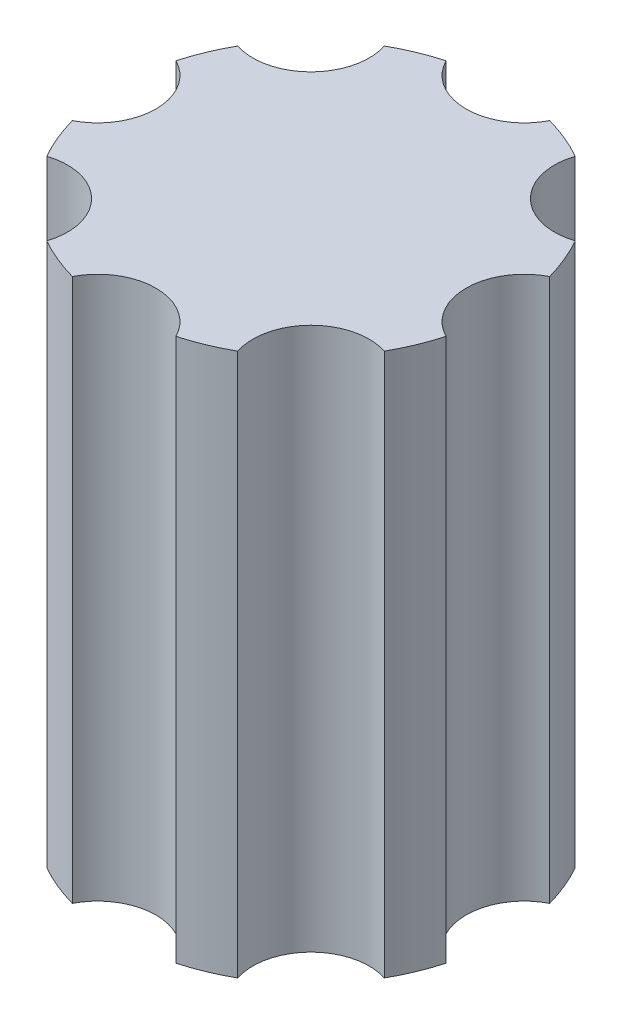
ISO-10303-21;
HEADER;
FILE_DESCRIPTION(('STEP AP214'),'2;1');
FILE_NAME('part.step','',(''),(''),'','','');
FILE_SCHEMA(('AUTOMOTIVE_DESIGN { 1 0 10303 214 1 1 1 1 }'));
ENDSEC;
DATA;
#1=APPLICATION_CONTEXT('core data for automotive mechanical design processes');
#2=APPLICATION_PROTOCOL_DEFINITION('international standard','automotive_design',2000,#1);
#3=PRODUCT_CONTEXT('',#1,'mechanical');
#4=PRODUCT('Part','Part','',(#3));
#5=PRODUCT_RELATED_PRODUCT_CATEGORY('part','',(#4));
#6=PRODUCT_DEFINITION_FORMATION('','',#4);
#7=PRODUCT_DEFINITION_CONTEXT('part definition',#1,'design');
#8=PRODUCT_DEFINITION('design','',#6,#7);
#9=PRODUCT_DEFINITION_SHAPE('','',#8);
#10=(LENGTH_UNIT() NAMED_UNIT(*) SI_UNIT(.MILLI.,.METRE.));
#11=(NAMED_UNIT(*) PLANE_ANGLE_UNIT() SI_UNIT($,.RADIAN.));
#12=(NAMED_UNIT(*) SI_UNIT($,.STERADIAN.) SOLID_ANGLE_UNIT());
#13=UNCERTAINTY_MEASURE_WITH_UNIT(LENGTH_MEASURE(1.E-05),#10,'distance_accuracy_value','');
#14=(GEOMETRIC_REPRESENTATION_CONTEXT(3) GLOBAL_UNCERTAINTY_ASSIGNED_CONTEXT((#13)) GLOBAL_UNIT_ASSIGNED_CONTEXT((#10,
#11,#12)) REPRESENTATION_CONTEXT('',''));
#15=CARTESIAN_POINT('',(0.,0.,0.));
#16=DIRECTION('',(0.,0.,1.));
#17=DIRECTION('',(1.,0.,0.));
#18=AXIS2_PLACEMENT_3D('',#15,#16,#17);
#19=CARTESIAN_POINT('',(0.,12.,0.));
#20=DIRECTION('',(0.,-1.,0.));
#21=DIRECTION('',(0.,0.,-1.));
#22=AXIS2_PLACEMENT_3D('',#19,#20,#21);
#23=CYLINDRICAL_SURFACE('',#22,5.);
#24=CARTESIAN_POINT('',(0.,0.,0.));
#25=DIRECTION('',(0.,1.,0.));
#26=DIRECTION('',(0.,0.,1.));
#27=AXIS2_PLACEMENT_3D('',#24,#25,#26);
#28=CIRCLE('',#27,5.);
#29=CARTESIAN_POINT('',(-4.35172402257276,0.,-2.46221405067942));
#30=VERTEX_POINT('',#29);
#31=CARTESIAN_POINT('',(-4.81818181818182,0.,-1.33608531424535));
#32=VERTEX_POINT('',#31);
#33=EDGE_CURVE('E192',#30,#32,#28,.T.);
#34=ORIENTED_EDGE('',*,*,#33,.T.);
#35=DIRECTION('',(0.,1.,0.));
#36=VECTOR('',#35,1.);
#37=CARTESIAN_POINT('',(-4.81818181818182,7.,-1.33608531424535));
#38=LINE('',#37,#36);
#39=CARTESIAN_POINT('',(-4.81818181818182,14.,-1.33608531424535));
#40=VERTEX_POINT('',#39);
#41=EDGE_CURVE('E247',#32,#40,#38,.T.);
#42=ORIENTED_EDGE('',*,*,#41,.T.);
#43=CARTESIAN_POINT('',(0.,14.,0.));
#44=DIRECTION('',(0.,1.,0.));
#45=DIRECTION('',(0.,0.,1.));
#46=AXIS2_PLACEMENT_3D('',#43,#44,#45);
#47=CIRCLE('',#46,5.);
#48=CARTESIAN_POINT('',(-4.35172402257276,14.,-2.46221405067943));
#49=VERTEX_POINT('',#48);
#50=EDGE_CURVE('E237',#49,#40,#47,.T.);
#51=ORIENTED_EDGE('',*,*,#50,.F.);
#52=DIRECTION('',(0.,1.,0.));
#53=VECTOR('',#52,1.);
#54=CARTESIAN_POINT('',(-4.35172402257276,7.,-2.46221405067942));
#55=LINE('',#54,#53);
#56=EDGE_CURVE('E181',#49,#30,#55,.F.);
#57=ORIENTED_EDGE('',*,*,#56,.T.);
#58=EDGE_LOOP('',(#34,#42,#51,#57));
#59=FACE_BOUND('',#58,.T.);
#60=ADVANCED_FACE('F45',(#59),#23,.T.);
#61=CARTESIAN_POINT('',(-4.81818181818181,14.,1.33608531424539));
#62=VERTEX_POINT('',#61);
#63=CARTESIAN_POINT('',(-4.35172402257274,14.,2.46221405067945));
#64=VERTEX_POINT('',#63);
#65=EDGE_CURVE('E348',#62,#64,#47,.T.);
#66=ORIENTED_EDGE('',*,*,#65,.F.);
#67=DIRECTION('',(0.,1.,0.));
#68=VECTOR('',#67,1.);
#69=CARTESIAN_POINT('',(-4.81818181818181,7.,1.33608531424539));
#70=LINE('',#69,#68);
#71=CARTESIAN_POINT('',(-4.81818181818181,0.,1.33608531424539));
#72=VERTEX_POINT('',#71);
#73=EDGE_CURVE('E251',#62,#72,#70,.F.);
#74=ORIENTED_EDGE('',*,*,#73,.T.);
#75=CARTESIAN_POINT('',(-4.35172402257274,0.,2.46221405067945));
#76=VERTEX_POINT('',#75);
#77=EDGE_CURVE('E208',#72,#76,#28,.T.);
#78=ORIENTED_EDGE('',*,*,#77,.T.);
#79=DIRECTION('',(0.,1.,0.));
#80=VECTOR('',#79,1.);
#81=CARTESIAN_POINT('',(-4.35172402257274,7.,2.46221405067945));
#82=LINE('',#81,#80);
#83=EDGE_CURVE('E255',#76,#64,#82,.T.);
#84=ORIENTED_EDGE('',*,*,#83,.T.);
#85=EDGE_LOOP('',(#66,#74,#78,#84));
#86=FACE_BOUND('',#85,.T.);
#87=ADVANCED_FACE('F336',(#86),#23,.T.);
#88=CARTESIAN_POINT('',(-2.46221405067941,14.,4.35172402257276));
#89=VERTEX_POINT('',#88);
#90=CARTESIAN_POINT('',(-1.33608531424537,14.,4.81818181818182));
#91=VERTEX_POINT('',#90);
#92=EDGE_CURVE('E344',#89,#91,#47,.T.);
#93=ORIENTED_EDGE('',*,*,#92,.F.);
#94=DIRECTION('',(0.,1.,0.));
#95=VECTOR('',#94,1.);
#96=CARTESIAN_POINT('',(-2.46221405067941,7.,4.35172402257276));
#97=LINE('',#96,#95);
#98=CARTESIAN_POINT('',(-2.46221405067941,0.,4.35172402257276));
#99=VERTEX_POINT('',#98);
#100=EDGE_CURVE('E259',#89,#99,#97,.F.);
#101=ORIENTED_EDGE('',*,*,#100,.T.);
#102=CARTESIAN_POINT('',(-1.33608531424537,0.,4.81818181818182));
#103=VERTEX_POINT('',#102);
#104=EDGE_CURVE('E325',#99,#103,#28,.T.);
#105=ORIENTED_EDGE('',*,*,#104,.T.);
#106=DIRECTION('',(0.,1.,0.));
#107=VECTOR('',#106,1.);
#108=CARTESIAN_POINT('',(-1.33608531424537,7.,4.81818181818182));
#109=LINE('',#108,#107);
#110=EDGE_CURVE('E263',#103,#91,#109,.T.);
#111=ORIENTED_EDGE('',*,*,#110,.T.);
#112=EDGE_LOOP('',(#93,#101,#105,#111));
#113=FACE_BOUND('',#112,.T.);
#114=ADVANCED_FACE('F342',(#113),#23,.T.);
#115=CARTESIAN_POINT('',(1.33608531424537,14.,4.81818181818182));
#116=VERTEX_POINT('',#115);
#117=CARTESIAN_POINT('',(2.46221405067947,14.,4.35172402257273));
#118=VERTEX_POINT('',#117);
#119=EDGE_CURVE('E349',#116,#118,#47,.T.);
#120=ORIENTED_EDGE('',*,*,#119,.F.);
#121=DIRECTION('',(0.,1.,0.));
#122=VECTOR('',#121,1.);
#123=CARTESIAN_POINT('',(1.33608531424537,7.,4.81818181818182));
#124=LINE('',#123,#122);
#125=CARTESIAN_POINT('',(1.33608531424537,0.,4.81818181818182));
#126=VERTEX_POINT('',#125);
#127=EDGE_CURVE('E267',#116,#126,#124,.F.);
#128=ORIENTED_EDGE('',*,*,#127,.T.);
#129=CARTESIAN_POINT('',(2.46221405067947,0.,4.35172402257273));
#130=VERTEX_POINT('',#129);
#131=EDGE_CURVE('E322',#126,#130,#28,.T.);
#132=ORIENTED_EDGE('',*,*,#131,.T.);
#133=DIRECTION('',(0.,1.,0.));
#134=VECTOR('',#133,1.);
#135=CARTESIAN_POINT('',(2.46221405067947,7.,4.35172402257273));
#136=LINE('',#135,#134);
#137=EDGE_CURVE('E271',#130,#118,#136,.T.);
#138=ORIENTED_EDGE('',*,*,#137,.T.);
#139=EDGE_LOOP('',(#120,#128,#132,#138));
#140=FACE_BOUND('',#139,.T.);
#141=ADVANCED_FACE('F398',(#140),#23,.T.);
#142=CARTESIAN_POINT('',(4.35172402257277,14.,2.4622140506794));
#143=VERTEX_POINT('',#142);
#144=CARTESIAN_POINT('',(4.81818181818183,14.,1.33608531424532));
#145=VERTEX_POINT('',#144);
#146=EDGE_CURVE('E353',#143,#145,#47,.T.);
#147=ORIENTED_EDGE('',*,*,#146,.F.);
#148=DIRECTION('',(0.,1.,0.));
#149=VECTOR('',#148,1.);
#150=CARTESIAN_POINT('',(4.35172402257277,7.,2.46221405067939));
#151=LINE('',#150,#149);
#152=CARTESIAN_POINT('',(4.35172402257277,0.,2.46221405067939));
#153=VERTEX_POINT('',#152);
#154=EDGE_CURVE('E275',#143,#153,#151,.F.);
#155=ORIENTED_EDGE('',*,*,#154,.T.);
#156=CARTESIAN_POINT('',(4.81818181818183,0.,1.33608531424532));
#157=VERTEX_POINT('',#156);
#158=EDGE_CURVE('E221',#153,#157,#28,.T.);
#159=ORIENTED_EDGE('',*,*,#158,.T.);
#160=DIRECTION('',(0.,1.,0.));
#161=VECTOR('',#160,1.);
#162=CARTESIAN_POINT('',(4.81818181818183,7.,1.33608531424532));
#163=LINE('',#162,#161);
#164=EDGE_CURVE('E279',#157,#145,#163,.T.);
#165=ORIENTED_EDGE('',*,*,#164,.T.);
#166=EDGE_LOOP('',(#147,#155,#159,#165));
#167=FACE_BOUND('',#166,.T.);
#168=ADVANCED_FACE('F319',(#167),#23,.T.);
#169=CARTESIAN_POINT('',(4.81818181818181,14.,-1.33608531424542));
#170=VERTEX_POINT('',#169);
#171=CARTESIAN_POINT('',(4.35172402257272,14.,-2.46221405067948));
#172=VERTEX_POINT('',#171);
#173=EDGE_CURVE('E357',#170,#172,#47,.T.);
#174=ORIENTED_EDGE('',*,*,#173,.F.);
#175=DIRECTION('',(0.,1.,0.));
#176=VECTOR('',#175,1.);
#177=CARTESIAN_POINT('',(4.8181818181818,7.,-1.33608531424542));
#178=LINE('',#177,#176);
#179=CARTESIAN_POINT('',(4.8181818181818,0.,-1.33608531424542));
#180=VERTEX_POINT('',#179);
#181=EDGE_CURVE('E69',#170,#180,#178,.F.);
#182=ORIENTED_EDGE('',*,*,#181,.T.);
#183=CARTESIAN_POINT('',(4.35172402257272,0.,-2.46221405067948));
#184=VERTEX_POINT('',#183);
#185=EDGE_CURVE('E212',#180,#184,#28,.T.);
#186=ORIENTED_EDGE('',*,*,#185,.T.);
#187=DIRECTION('',(0.,1.,0.));
#188=VECTOR('',#187,1.);
#189=CARTESIAN_POINT('',(4.35172402257272,7.,-2.46221405067948));
#190=LINE('',#189,#188);
#191=EDGE_CURVE('E285',#184,#172,#190,.T.);
#192=ORIENTED_EDGE('',*,*,#191,.T.);
#193=EDGE_LOOP('',(#174,#182,#186,#192));
#194=FACE_BOUND('',#193,.T.);
#195=ADVANCED_FACE('F388',(#194),#23,.T.);
#196=CARTESIAN_POINT('',(-1.33608531424537,0.,-4.81818181818182));
#197=VERTEX_POINT('',#196);
#198=CARTESIAN_POINT('',(-2.46221405067944,0.,-4.35172402257275));
#199=VERTEX_POINT('',#198);
#200=EDGE_CURVE('E189',#197,#199,#28,.T.);
#201=ORIENTED_EDGE('',*,*,#200,.T.);
#202=DIRECTION('',(0.,1.,0.));
#203=VECTOR('',#202,1.);
#204=CARTESIAN_POINT('',(-2.46221405067944,7.,-4.35172402257275));
#205=LINE('',#204,#203);
#206=CARTESIAN_POINT('',(-2.46221405067944,14.,-4.35172402257275));
#207=VERTEX_POINT('',#206);
#208=EDGE_CURVE('E169',#199,#207,#205,.T.);
#209=ORIENTED_EDGE('',*,*,#208,.T.);
#210=CARTESIAN_POINT('',(-1.33608531424537,14.,-4.81818181818182));
#211=VERTEX_POINT('',#210);
#212=EDGE_CURVE('E228',#211,#207,#47,.T.);
#213=ORIENTED_EDGE('',*,*,#212,.F.);
#214=DIRECTION('',(0.,1.,0.));
#215=VECTOR('',#214,1.);
#216=CARTESIAN_POINT('',(-1.33608531424537,7.,-4.81818181818182));
#217=LINE('',#216,#215);
#218=EDGE_CURVE('E198',#211,#197,#217,.F.);
#219=ORIENTED_EDGE('',*,*,#218,.T.);
#220=EDGE_LOOP('',(#201,#209,#213,#219));
#221=FACE_BOUND('',#220,.T.);
#222=ADVANCED_FACE('F197',(#221),#23,.T.);
#223=CARTESIAN_POINT('',(0.,12.,0.));
#224=DIRECTION('',(0.,-1.,0.));
#225=DIRECTION('',(0.,0.,-1.));
#226=AXIS2_PLACEMENT_3D('',#223,#224,#225);
#227=CYLINDRICAL_SURFACE('',#226,3.);
#228=CARTESIAN_POINT('',(0.,0.,0.));
#229=DIRECTION('',(0.,1.,0.));
#230=DIRECTION('',(0.,0.,1.));
#231=AXIS2_PLACEMENT_3D('',#228,#229,#230);
#232=CIRCLE('',#231,3.);
#233=CARTESIAN_POINT('',(2.23606797749979,0.,2.));
#234=VERTEX_POINT('',#233);
#235=CARTESIAN_POINT('',(-2.23606797749979,0.,2.));
#236=VERTEX_POINT('',#235);
#237=EDGE_CURVE('E223',#234,#236,#232,.T.);
#238=ORIENTED_EDGE('',*,*,#237,.F.);
#239=DIRECTION('',(0.,-1.,0.));
#240=VECTOR('',#239,1.);
#241=CARTESIAN_POINT('',(2.23606797749979,12.,2.));
#242=LINE('',#241,#240);
#243=CARTESIAN_POINT('',(2.23606797749979,12.,2.));
#244=VERTEX_POINT('',#243);
#245=EDGE_CURVE('E372',#244,#234,#242,.T.);
#246=ORIENTED_EDGE('',*,*,#245,.F.);
#247=CARTESIAN_POINT('',(0.,12.,0.));
#248=DIRECTION('',(0.,1.,0.));
#249=DIRECTION('',(0.,0.,1.));
#250=AXIS2_PLACEMENT_3D('',#247,#248,#249);
#251=CIRCLE('',#250,3.);
#252=CARTESIAN_POINT('',(-2.23606797749979,12.,2.));
#253=VERTEX_POINT('',#252);
#254=EDGE_CURVE('E200',#244,#253,#251,.T.);
#255=ORIENTED_EDGE('',*,*,#254,.T.);
#256=DIRECTION('',(0.,-1.,0.));
#257=VECTOR('',#256,1.);
#258=CARTESIAN_POINT('',(-2.23606797749979,12.,2.));
#259=LINE('',#258,#257);
#260=EDGE_CURVE('E233',#253,#236,#259,.T.);
#261=ORIENTED_EDGE('',*,*,#260,.T.);
#262=EDGE_LOOP('',(#238,#246,#255,#261));
#263=FACE_BOUND('',#262,.T.);
#264=ADVANCED_FACE('F47',(#263),#227,.F.);
#265=CARTESIAN_POINT('',(0.,12.,2.));
#266=DIRECTION('',(0.,0.,-1.));
#267=DIRECTION('',(-1.,0.,0.));
#268=AXIS2_PLACEMENT_3D('',#265,#266,#267);
#269=PLANE('',#268);
#270=DIRECTION('',(1.,0.,0.));
#271=VECTOR('',#270,1.);
#272=CARTESIAN_POINT('',(0.,0.,2.));
#273=LINE('',#272,#271);
#274=EDGE_CURVE('E213',#236,#234,#273,.T.);
#275=ORIENTED_EDGE('',*,*,#274,.F.);
#276=ORIENTED_EDGE('',*,*,#260,.F.);
#277=DIRECTION('',(1.,0.,0.));
#278=VECTOR('',#277,1.);
#279=CARTESIAN_POINT('',(0.,12.,2.));
#280=LINE('',#279,#278);
#281=EDGE_CURVE('E206',#253,#244,#280,.T.);
#282=ORIENTED_EDGE('',*,*,#281,.T.);
#283=ORIENTED_EDGE('',*,*,#245,.T.);
#284=EDGE_LOOP('',(#275,#276,#282,#283));
#285=FACE_BOUND('',#284,.T.);
#286=ADVANCED_FACE('F376',(#285),#269,.T.);
#287=CARTESIAN_POINT('',(2.46221405067938,14.,-4.35172402257278));
#288=VERTEX_POINT('',#287);
#289=CARTESIAN_POINT('',(1.33608531424537,14.,-4.81818181818182));
#290=VERTEX_POINT('',#289);
#291=EDGE_CURVE('E238',#288,#290,#47,.T.);
#292=ORIENTED_EDGE('',*,*,#291,.F.);
#293=DIRECTION('',(0.,1.,0.));
#294=VECTOR('',#293,1.);
#295=CARTESIAN_POINT('',(2.46221405067938,7.,-4.35172402257278));
#296=LINE('',#295,#294);
#297=CARTESIAN_POINT('',(2.46221405067938,0.,-4.35172402257278));
#298=VERTEX_POINT('',#297);
#299=EDGE_CURVE('E61',#288,#298,#296,.F.);
#300=ORIENTED_EDGE('',*,*,#299,.T.);
#301=CARTESIAN_POINT('',(1.33608531424537,0.,-4.81818181818182));
#302=VERTEX_POINT('',#301);
#303=EDGE_CURVE('E202',#298,#302,#28,.T.);
#304=ORIENTED_EDGE('',*,*,#303,.T.);
#305=DIRECTION('',(0.,1.,0.));
#306=VECTOR('',#305,1.);
#307=CARTESIAN_POINT('',(1.33608531424537,7.,-4.81818181818182));
#308=LINE('',#307,#306);
#309=EDGE_CURVE('E239',#302,#290,#308,.T.);
#310=ORIENTED_EDGE('',*,*,#309,.T.);
#311=EDGE_LOOP('',(#292,#300,#304,#310));
#312=FACE_BOUND('',#311,.T.);
#313=ADVANCED_FACE('F374',(#312),#23,.T.);
#314=CARTESIAN_POINT('',(0.,0.,0.));
#315=DIRECTION('',(0.,1.,0.));
#316=DIRECTION('',(0.,0.,1.));
#317=AXIS2_PLACEMENT_3D('',#314,#315,#316);
#318=PLANE('',#317);
#319=ORIENTED_EDGE('',*,*,#237,.T.);
#320=ORIENTED_EDGE('',*,*,#274,.T.);
#321=EDGE_LOOP('',(#319,#320));
#322=FACE_BOUND('',#321,.T.);
#323=ORIENTED_EDGE('',*,*,#77,.F.);
#324=CARTESIAN_POINT('',(-5.5,0.,0.));
#325=DIRECTION('',(0.,1.,0.));
#326=DIRECTION('',(1.,0.,0.));
#327=AXIS2_PLACEMENT_3D('',#324,#325,#326);
#328=CIRCLE('',#327,1.5);
#329=EDGE_CURVE('E194',#72,#32,#328,.T.);
#330=ORIENTED_EDGE('',*,*,#329,.T.);
#331=ORIENTED_EDGE('',*,*,#33,.F.);
#332=CARTESIAN_POINT('',(-3.88908729652602,0.,-3.889087296526));
#333=DIRECTION('',(0.,1.,0.));
#334=DIRECTION('',(0.707106781186549,0.,0.707106781186546));
#335=AXIS2_PLACEMENT_3D('',#332,#333,#334);
#336=CIRCLE('',#335,1.5);
#337=EDGE_CURVE('E172',#30,#199,#336,.T.);
#338=ORIENTED_EDGE('',*,*,#337,.T.);
#339=ORIENTED_EDGE('',*,*,#200,.F.);
#340=CARTESIAN_POINT('',(0.,0.,-5.5));
#341=DIRECTION('',(0.,1.,0.));
#342=DIRECTION('',(0.,0.,1.));
#343=AXIS2_PLACEMENT_3D('',#340,#341,#342);
#344=CIRCLE('',#343,1.5);
#345=EDGE_CURVE('E244',#197,#302,#344,.T.);
#346=ORIENTED_EDGE('',*,*,#345,.T.);
#347=ORIENTED_EDGE('',*,*,#303,.F.);
#348=CARTESIAN_POINT('',(3.88908729652596,0.,-3.88908729652606));
#349=DIRECTION('',(0.,1.,0.));
#350=DIRECTION('',(-0.707106781186539,0.,0.707106781186556));
#351=AXIS2_PLACEMENT_3D('',#348,#349,#350);
#352=CIRCLE('',#351,1.5);
#353=EDGE_CURVE('E308',#298,#184,#352,.T.);
#354=ORIENTED_EDGE('',*,*,#353,.T.);
#355=ORIENTED_EDGE('',*,*,#185,.F.);
#356=CARTESIAN_POINT('',(5.5,0.,0.));
#357=DIRECTION('',(0.,1.,0.));
#358=DIRECTION('',(-1.,0.,0.));
#359=AXIS2_PLACEMENT_3D('',#356,#357,#358);
#360=CIRCLE('',#359,1.5);
#361=EDGE_CURVE('E298',#180,#157,#360,.T.);
#362=ORIENTED_EDGE('',*,*,#361,.T.);
#363=ORIENTED_EDGE('',*,*,#158,.F.);
#364=CARTESIAN_POINT('',(3.88908729652605,0.,3.88908729652598));
#365=DIRECTION('',(0.,1.,0.));
#366=DIRECTION('',(-0.707106781186554,0.,-0.707106781186541));
#367=AXIS2_PLACEMENT_3D('',#364,#365,#366);
#368=CIRCLE('',#367,1.5);
#369=EDGE_CURVE('E293',#153,#130,#368,.T.);
#370=ORIENTED_EDGE('',*,*,#369,.T.);
#371=ORIENTED_EDGE('',*,*,#131,.F.);
#372=CARTESIAN_POINT('',(0.,0.,5.5));
#373=DIRECTION('',(0.,1.,0.));
#374=DIRECTION('',(0.,0.,-1.));
#375=AXIS2_PLACEMENT_3D('',#372,#373,#374);
#376=CIRCLE('',#375,1.5);
#377=EDGE_CURVE('E297',#126,#103,#376,.T.);
#378=ORIENTED_EDGE('',*,*,#377,.T.);
#379=ORIENTED_EDGE('',*,*,#104,.F.);
#380=CARTESIAN_POINT('',(-3.88908729652599,0.,3.88908729652603));
#381=DIRECTION('',(0.,1.,0.));
#382=DIRECTION('',(0.707106781186544,0.,-0.707106781186551));
#383=AXIS2_PLACEMENT_3D('',#380,#381,#382);
#384=CIRCLE('',#383,1.5);
#385=EDGE_CURVE('E302',#99,#76,#384,.T.);
#386=ORIENTED_EDGE('',*,*,#385,.T.);
#387=EDGE_LOOP('',(#323,#330,#331,#338,#339,#346,#347,#354,#355,#362,#363,#370,#371,#378,#379,#386));
#388=FACE_BOUND('',#387,.T.);
#389=ADVANCED_FACE('F187',(#322,#388),#318,.F.);
#390=CARTESIAN_POINT('',(0.,12.,0.));
#391=DIRECTION('',(0.,1.,0.));
#392=DIRECTION('',(0.,0.,1.));
#393=AXIS2_PLACEMENT_3D('',#390,#391,#392);
#394=PLANE('',#393);
#395=ORIENTED_EDGE('',*,*,#254,.F.);
#396=ORIENTED_EDGE('',*,*,#281,.F.);
#397=EDGE_LOOP('',(#395,#396));
#398=FACE_BOUND('',#397,.T.);
#399=ADVANCED_FACE('F382',(#398),#394,.F.);
#400=CARTESIAN_POINT('',(0.,14.,0.));
#401=DIRECTION('',(0.,1.,0.));
#402=DIRECTION('',(0.,0.,1.));
#403=AXIS2_PLACEMENT_3D('',#400,#401,#402);
#404=PLANE('',#403);
#405=CARTESIAN_POINT('',(-5.5,14.,0.));
#406=DIRECTION('',(0.,1.,0.));
#407=DIRECTION('',(0.,0.,1.));
#408=AXIS2_PLACEMENT_3D('',#405,#406,#407);
#409=CIRCLE('',#408,1.5);
#410=EDGE_CURVE('E11',#62,#40,#409,.T.);
#411=ORIENTED_EDGE('',*,*,#410,.F.);
#412=ORIENTED_EDGE('',*,*,#65,.T.);
#413=CARTESIAN_POINT('',(-3.88908729652599,14.,3.88908729652603));
#414=DIRECTION('',(0.,1.,0.));
#415=DIRECTION('',(0.,0.,1.));
#416=AXIS2_PLACEMENT_3D('',#413,#414,#415);
#417=CIRCLE('',#416,1.5);
#418=EDGE_CURVE('E54',#89,#64,#417,.T.);
#419=ORIENTED_EDGE('',*,*,#418,.F.);
#420=ORIENTED_EDGE('',*,*,#92,.T.);
#421=CARTESIAN_POINT('',(0.,14.,5.5));
#422=DIRECTION('',(0.,1.,0.));
#423=DIRECTION('',(0.,0.,1.));
#424=AXIS2_PLACEMENT_3D('',#421,#422,#423);
#425=CIRCLE('',#424,1.5);
#426=EDGE_CURVE('E411',#116,#91,#425,.T.);
#427=ORIENTED_EDGE('',*,*,#426,.F.);
#428=ORIENTED_EDGE('',*,*,#119,.T.);
#429=CARTESIAN_POINT('',(3.88908729652605,14.,3.88908729652598));
#430=DIRECTION('',(0.,1.,0.));
#431=DIRECTION('',(0.,0.,1.));
#432=AXIS2_PLACEMENT_3D('',#429,#430,#431);
#433=CIRCLE('',#432,1.5);
#434=EDGE_CURVE('E405',#143,#118,#433,.T.);
#435=ORIENTED_EDGE('',*,*,#434,.F.);
#436=ORIENTED_EDGE('',*,*,#146,.T.);
#437=CARTESIAN_POINT('',(5.5,14.,0.));
#438=DIRECTION('',(0.,1.,0.));
#439=DIRECTION('',(0.,0.,1.));
#440=AXIS2_PLACEMENT_3D('',#437,#438,#439);
#441=CIRCLE('',#440,1.5);
#442=EDGE_CURVE('E401',#170,#145,#441,.T.);
#443=ORIENTED_EDGE('',*,*,#442,.F.);
#444=ORIENTED_EDGE('',*,*,#173,.T.);
#445=CARTESIAN_POINT('',(3.88908729652596,14.,-3.88908729652606));
#446=DIRECTION('',(0.,1.,0.));
#447=DIRECTION('',(0.,0.,1.));
#448=AXIS2_PLACEMENT_3D('',#445,#446,#447);
#449=CIRCLE('',#448,1.5);
#450=EDGE_CURVE('E368',#288,#172,#449,.T.);
#451=ORIENTED_EDGE('',*,*,#450,.F.);
#452=ORIENTED_EDGE('',*,*,#291,.T.);
#453=CARTESIAN_POINT('',(0.,14.,-5.5));
#454=DIRECTION('',(0.,1.,0.));
#455=DIRECTION('',(0.,0.,1.));
#456=AXIS2_PLACEMENT_3D('',#453,#454,#455);
#457=CIRCLE('',#456,1.5);
#458=EDGE_CURVE('E367',#211,#290,#457,.T.);
#459=ORIENTED_EDGE('',*,*,#458,.F.);
#460=ORIENTED_EDGE('',*,*,#212,.T.);
#461=CARTESIAN_POINT('',(-3.88908729652602,14.,-3.889087296526));
#462=DIRECTION('',(0.,1.,0.));
#463=DIRECTION('',(0.,0.,1.));
#464=AXIS2_PLACEMENT_3D('',#461,#462,#463);
#465=CIRCLE('',#464,1.5);
#466=EDGE_CURVE('E175',#49,#207,#465,.T.);
#467=ORIENTED_EDGE('',*,*,#466,.F.);
#468=ORIENTED_EDGE('',*,*,#50,.T.);
#469=EDGE_LOOP('',(#411,#412,#419,#420,#427,#428,#435,#436,#443,#444,#451,#452,#459,#460,#467,#468));
#470=FACE_BOUND('',#469,.T.);
#471=ADVANCED_FACE('F366',(#470),#404,.T.);
#472=CARTESIAN_POINT('',(0.,0.,-5.5));
#473=DIRECTION('',(0.,1.,0.));
#474=DIRECTION('',(0.,0.,1.));
#475=AXIS2_PLACEMENT_3D('',#472,#473,#474);
#476=CYLINDRICAL_SURFACE('',#475,1.5);
#477=ORIENTED_EDGE('',*,*,#345,.F.);
#478=ORIENTED_EDGE('',*,*,#218,.F.);
#479=ORIENTED_EDGE('',*,*,#458,.T.);
#480=ORIENTED_EDGE('',*,*,#309,.F.);
#481=EDGE_LOOP('',(#477,#478,#479,#480));
#482=FACE_BOUND('',#481,.T.);
#483=ADVANCED_FACE('F370',(#482),#476,.F.);
#484=CARTESIAN_POINT('',(-3.88908729652602,0.,-3.889087296526));
#485=DIRECTION('',(0.,1.,0.));
#486=DIRECTION('',(0.,0.,1.));
#487=AXIS2_PLACEMENT_3D('',#484,#485,#486);
#488=CYLINDRICAL_SURFACE('',#487,1.5);
#489=ORIENTED_EDGE('',*,*,#337,.F.);
#490=ORIENTED_EDGE('',*,*,#56,.F.);
#491=ORIENTED_EDGE('',*,*,#466,.T.);
#492=ORIENTED_EDGE('',*,*,#208,.F.);
#493=EDGE_LOOP('',(#489,#490,#491,#492));
#494=FACE_BOUND('',#493,.T.);
#495=ADVANCED_FACE('F171',(#494),#488,.F.);
#496=CARTESIAN_POINT('',(3.88908729652596,0.,-3.88908729652606));
#497=DIRECTION('',(0.,1.,0.));
#498=DIRECTION('',(0.,0.,1.));
#499=AXIS2_PLACEMENT_3D('',#496,#497,#498);
#500=CYLINDRICAL_SURFACE('',#499,1.5);
#501=ORIENTED_EDGE('',*,*,#353,.F.);
#502=ORIENTED_EDGE('',*,*,#299,.F.);
#503=ORIENTED_EDGE('',*,*,#450,.T.);
#504=ORIENTED_EDGE('',*,*,#191,.F.);
#505=EDGE_LOOP('',(#501,#502,#503,#504));
#506=FACE_BOUND('',#505,.T.);
#507=ADVANCED_FACE('F399',(#506),#500,.F.);
#508=CARTESIAN_POINT('',(5.5,0.,0.));
#509=DIRECTION('',(0.,1.,0.));
#510=DIRECTION('',(0.,0.,1.));
#511=AXIS2_PLACEMENT_3D('',#508,#509,#510);
#512=CYLINDRICAL_SURFACE('',#511,1.5);
#513=ORIENTED_EDGE('',*,*,#361,.F.);
#514=ORIENTED_EDGE('',*,*,#181,.F.);
#515=ORIENTED_EDGE('',*,*,#442,.T.);
#516=ORIENTED_EDGE('',*,*,#164,.F.);
#517=EDGE_LOOP('',(#513,#514,#515,#516));
#518=FACE_BOUND('',#517,.T.);
#519=ADVANCED_FACE('F435',(#518),#512,.F.);
#520=CARTESIAN_POINT('',(3.88908729652605,0.,3.88908729652598));
#521=DIRECTION('',(0.,1.,0.));
#522=DIRECTION('',(0.,0.,1.));
#523=AXIS2_PLACEMENT_3D('',#520,#521,#522);
#524=CYLINDRICAL_SURFACE('',#523,1.5);
#525=ORIENTED_EDGE('',*,*,#369,.F.);
#526=ORIENTED_EDGE('',*,*,#154,.F.);
#527=ORIENTED_EDGE('',*,*,#434,.T.);
#528=ORIENTED_EDGE('',*,*,#137,.F.);
#529=EDGE_LOOP('',(#525,#526,#527,#528));
#530=FACE_BOUND('',#529,.T.);
#531=ADVANCED_FACE('F431',(#530),#524,.F.);
#532=CARTESIAN_POINT('',(0.,0.,5.5));
#533=DIRECTION('',(0.,1.,0.));
#534=DIRECTION('',(0.,0.,1.));
#535=AXIS2_PLACEMENT_3D('',#532,#533,#534);
#536=CYLINDRICAL_SURFACE('',#535,1.5);
#537=ORIENTED_EDGE('',*,*,#377,.F.);
#538=ORIENTED_EDGE('',*,*,#127,.F.);
#539=ORIENTED_EDGE('',*,*,#426,.T.);
#540=ORIENTED_EDGE('',*,*,#110,.F.);
#541=EDGE_LOOP('',(#537,#538,#539,#540));
#542=FACE_BOUND('',#541,.T.);
#543=ADVANCED_FACE('F424',(#542),#536,.F.);
#544=CARTESIAN_POINT('',(-3.88908729652599,0.,3.88908729652603));
#545=DIRECTION('',(0.,1.,0.));
#546=DIRECTION('',(0.,0.,1.));
#547=AXIS2_PLACEMENT_3D('',#544,#545,#546);
#548=CYLINDRICAL_SURFACE('',#547,1.5);
#549=ORIENTED_EDGE('',*,*,#385,.F.);
#550=ORIENTED_EDGE('',*,*,#100,.F.);
#551=ORIENTED_EDGE('',*,*,#418,.T.);
#552=ORIENTED_EDGE('',*,*,#83,.F.);
#553=EDGE_LOOP('',(#549,#550,#551,#552));
#554=FACE_BOUND('',#553,.T.);
#555=ADVANCED_FACE('F339',(#554),#548,.F.);
#556=CARTESIAN_POINT('',(-5.5,0.,0.));
#557=DIRECTION('',(0.,1.,0.));
#558=DIRECTION('',(0.,0.,1.));
#559=AXIS2_PLACEMENT_3D('',#556,#557,#558);
#560=CYLINDRICAL_SURFACE('',#559,1.5);
#561=ORIENTED_EDGE('',*,*,#329,.F.);
#562=ORIENTED_EDGE('',*,*,#73,.F.);
#563=ORIENTED_EDGE('',*,*,#410,.T.);
#564=ORIENTED_EDGE('',*,*,#41,.F.);
#565=EDGE_LOOP('',(#561,#562,#563,#564));
#566=FACE_BOUND('',#565,.T.);
#567=ADVANCED_FACE('F417',(#566),#560,.F.);
#568=CLOSED_SHELL('',(#60,#87,#114,#141,#168,#195,#222,#264,#286,#313,#389,#399,#471,#483,#495,
#507,#519,#531,#543,#555,#567));
#569=MANIFOLD_SOLID_BREP('B2',#568);
#570=ADVANCED_BREP_SHAPE_REPRESENTATION('',(#18,#569),#14);
#571=SHAPE_DEFINITION_REPRESENTATION(#9,#570);
ENDSEC;
END-ISO-10303-21;
